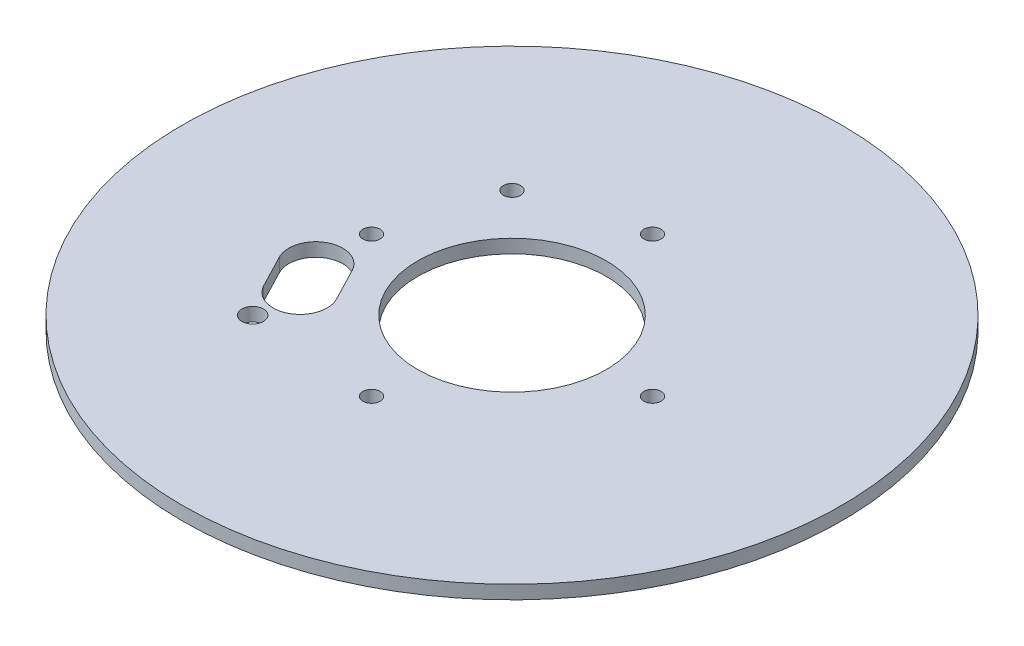
ISO-10303-21;
HEADER;
FILE_DESCRIPTION(('STEP AP214'),'2;1');
FILE_NAME('part.step','',(''),(''),'','','');
FILE_SCHEMA(('AUTOMOTIVE_DESIGN { 1 0 10303 214 1 1 1 1 }'));
ENDSEC;
DATA;
#1=APPLICATION_CONTEXT('core data for automotive mechanical design processes');
#2=APPLICATION_PROTOCOL_DEFINITION('international standard','automotive_design',2000,#1);
#3=PRODUCT_CONTEXT('',#1,'mechanical');
#4=PRODUCT('Part','Part','',(#3));
#5=PRODUCT_RELATED_PRODUCT_CATEGORY('part','',(#4));
#6=PRODUCT_DEFINITION_FORMATION('','',#4);
#7=PRODUCT_DEFINITION_CONTEXT('part definition',#1,'design');
#8=PRODUCT_DEFINITION('design','',#6,#7);
#9=PRODUCT_DEFINITION_SHAPE('','',#8);
#10=(LENGTH_UNIT() NAMED_UNIT(*) SI_UNIT(.MILLI.,.METRE.));
#11=(NAMED_UNIT(*) PLANE_ANGLE_UNIT() SI_UNIT($,.RADIAN.));
#12=(NAMED_UNIT(*) SI_UNIT($,.STERADIAN.) SOLID_ANGLE_UNIT());
#13=UNCERTAINTY_MEASURE_WITH_UNIT(LENGTH_MEASURE(1.E-05),#10,'distance_accuracy_value','');
#14=(GEOMETRIC_REPRESENTATION_CONTEXT(3) GLOBAL_UNCERTAINTY_ASSIGNED_CONTEXT((#13)) GLOBAL_UNIT_ASSIGNED_CONTEXT((#10,
#11,#12)) REPRESENTATION_CONTEXT('',''));
#15=CARTESIAN_POINT('',(0.,0.,0.));
#16=DIRECTION('',(0.,0.,1.));
#17=DIRECTION('',(1.,0.,0.));
#18=AXIS2_PLACEMENT_3D('',#15,#16,#17);
#19=CARTESIAN_POINT('',(0.,3.175,0.));
#20=DIRECTION('',(0.,-1.,0.));
#21=DIRECTION('',(0.,0.,-1.));
#22=AXIS2_PLACEMENT_3D('',#19,#20,#21);
#23=CYLINDRICAL_SURFACE('',#22,77.4600051);
#24=CARTESIAN_POINT('',(0.,3.175,0.));
#25=DIRECTION('',(0.,1.,0.));
#26=DIRECTION('',(0.,0.,1.));
#27=AXIS2_PLACEMENT_3D('',#24,#25,#26);
#28=CIRCLE('',#27,77.4600051);
#29=CARTESIAN_POINT('',(0.,3.175,77.4600051));
#30=VERTEX_POINT('',#29);
#31=EDGE_CURVE('E11',#30,#30,#28,.T.);
#32=ORIENTED_EDGE('',*,*,#31,.F.);
#33=EDGE_LOOP('',(#32));
#34=FACE_BOUND('',#33,.T.);
#35=CARTESIAN_POINT('',(0.,0.,0.));
#36=DIRECTION('',(0.,1.,0.));
#37=DIRECTION('',(0.,0.,1.));
#38=AXIS2_PLACEMENT_3D('',#35,#36,#37);
#39=CIRCLE('',#38,77.4600051);
#40=CARTESIAN_POINT('',(0.,0.,77.4600051));
#41=VERTEX_POINT('',#40);
#42=EDGE_CURVE('E38',#41,#41,#39,.T.);
#43=ORIENTED_EDGE('',*,*,#42,.T.);
#44=EDGE_LOOP('',(#43));
#45=FACE_BOUND('',#44,.T.);
#46=ADVANCED_FACE('F35',(#34,#45),#23,.T.);
#47=CARTESIAN_POINT('',(0.,3.175,0.));
#48=DIRECTION('',(0.,1.,0.));
#49=DIRECTION('',(0.,0.,1.));
#50=AXIS2_PLACEMENT_3D('',#47,#48,#49);
#51=PLANE('',#50);
#52=CARTESIAN_POINT('',(-33.5359357397664,3.175,12.5896679089743));
#53=DIRECTION('',(0.,1.,0.));
#54=DIRECTION('',(0.,0.,1.));
#55=AXIS2_PLACEMENT_3D('',#52,#53,#54);
#56=CIRCLE('',#55,6.35);
#57=CARTESIAN_POINT('',(-27.9034169490847,3.175,9.65756421493181));
#58=VERTEX_POINT('',#57);
#59=CARTESIAN_POINT('',(-39.1684545304481,3.175,15.5217716030168));
#60=VERTEX_POINT('',#59);
#61=EDGE_CURVE('E49',#58,#60,#56,.T.);
#62=ORIENTED_EDGE('',*,*,#61,.F.);
#63=DIRECTION('',(-0.461748613235035,0.,-0.887010833178221));
#64=VECTOR('',#63,1.);
#65=CARTESIAN_POINT('',(-27.9034169490847,3.175,9.65756421493181));
#66=LINE('',#65,#64);
#67=CARTESIAN_POINT('',(-23.9157559251869,3.175,17.3177897702589));
#68=VERTEX_POINT('',#67);
#69=EDGE_CURVE('E93',#68,#58,#66,.T.);
#70=ORIENTED_EDGE('',*,*,#69,.F.);
#71=CARTESIAN_POINT('',(-29.5482747158687,3.175,20.2498934643014));
#72=DIRECTION('',(0.,1.,0.));
#73=DIRECTION('',(0.,0.,1.));
#74=AXIS2_PLACEMENT_3D('',#71,#72,#73);
#75=CIRCLE('',#74,6.35);
#76=CARTESIAN_POINT('',(-35.1807935065504,3.175,23.1819971583439));
#77=VERTEX_POINT('',#76);
#78=EDGE_CURVE('E96',#77,#68,#75,.T.);
#79=ORIENTED_EDGE('',*,*,#78,.F.);
#80=DIRECTION('',(0.461748613235035,0.,0.887010833178221));
#81=VECTOR('',#80,1.);
#82=CARTESIAN_POINT('',(-39.1684545304481,3.175,15.5217716030168));
#83=LINE('',#82,#81);
#84=EDGE_CURVE('E105',#60,#77,#83,.T.);
#85=ORIENTED_EDGE('',*,*,#84,.F.);
#86=EDGE_LOOP('',(#62,#70,#79,#85));
#87=FACE_BOUND('',#86,.T.);
#88=CARTESIAN_POINT('',(-25.4,3.175,-25.4));
#89=DIRECTION('',(0.,1.,0.));
#90=DIRECTION('',(0.,0.,1.));
#91=AXIS2_PLACEMENT_3D('',#88,#89,#90);
#92=CIRCLE('',#91,2.0193);
#93=CARTESIAN_POINT('',(-25.4,3.175,-23.3807));
#94=VERTEX_POINT('',#93);
#95=EDGE_CURVE('E99',#94,#94,#92,.T.);
#96=ORIENTED_EDGE('',*,*,#95,.F.);
#97=EDGE_LOOP('',(#96));
#98=FACE_BOUND('',#97,.T.);
#99=CARTESIAN_POINT('',(-30.48,3.175,30.48));
#100=DIRECTION('',(0.,1.,0.));
#101=DIRECTION('',(0.,0.,1.));
#102=AXIS2_PLACEMENT_3D('',#99,#100,#101);
#103=CIRCLE('',#102,2.54);
#104=CARTESIAN_POINT('',(-30.48,3.175,33.02));
#105=VERTEX_POINT('',#104);
#106=EDGE_CURVE('E208',#105,#105,#103,.T.);
#107=ORIENTED_EDGE('',*,*,#106,.F.);
#108=EDGE_LOOP('',(#107));
#109=FACE_BOUND('',#108,.T.);
#110=CARTESIAN_POINT('',(0.,3.175,33.02));
#111=DIRECTION('',(0.,1.,0.));
#112=DIRECTION('',(0.,0.,1.));
#113=AXIS2_PLACEMENT_3D('',#110,#111,#112);
#114=CIRCLE('',#113,2.0193);
#115=CARTESIAN_POINT('',(0.,3.175,35.0393));
#116=VERTEX_POINT('',#115);
#117=EDGE_CURVE('E202',#116,#116,#114,.T.);
#118=ORIENTED_EDGE('',*,*,#117,.F.);
#119=EDGE_LOOP('',(#118));
#120=FACE_BOUND('',#119,.T.);
#121=CARTESIAN_POINT('',(-33.02,3.175,0.));
#122=DIRECTION('',(0.,1.,0.));
#123=DIRECTION('',(0.,0.,1.));
#124=AXIS2_PLACEMENT_3D('',#121,#122,#123);
#125=CIRCLE('',#124,2.0193);
#126=CARTESIAN_POINT('',(-33.02,3.175,2.0193));
#127=VERTEX_POINT('',#126);
#128=EDGE_CURVE('E130',#127,#127,#125,.T.);
#129=ORIENTED_EDGE('',*,*,#128,.F.);
#130=EDGE_LOOP('',(#129));
#131=FACE_BOUND('',#130,.T.);
#132=CARTESIAN_POINT('',(33.02,3.175,0.));
#133=DIRECTION('',(0.,1.,0.));
#134=DIRECTION('',(0.,0.,1.));
#135=AXIS2_PLACEMENT_3D('',#132,#133,#134);
#136=CIRCLE('',#135,2.0193);
#137=CARTESIAN_POINT('',(33.02,3.175,2.0193));
#138=VERTEX_POINT('',#137);
#139=EDGE_CURVE('E124',#138,#138,#136,.T.);
#140=ORIENTED_EDGE('',*,*,#139,.F.);
#141=EDGE_LOOP('',(#140));
#142=FACE_BOUND('',#141,.T.);
#143=CARTESIAN_POINT('',(0.,3.175,-33.02));
#144=DIRECTION('',(0.,1.,0.));
#145=DIRECTION('',(0.,0.,1.));
#146=AXIS2_PLACEMENT_3D('',#143,#144,#145);
#147=CIRCLE('',#146,2.0193);
#148=CARTESIAN_POINT('',(0.,3.175,-31.0007));
#149=VERTEX_POINT('',#148);
#150=EDGE_CURVE('E118',#149,#149,#147,.T.);
#151=ORIENTED_EDGE('',*,*,#150,.F.);
#152=EDGE_LOOP('',(#151));
#153=FACE_BOUND('',#152,.T.);
#154=CARTESIAN_POINT('',(0.,3.175,0.));
#155=DIRECTION('',(0.,1.,0.));
#156=DIRECTION('',(0.,0.,1.));
#157=AXIS2_PLACEMENT_3D('',#154,#155,#156);
#158=CIRCLE('',#157,22.1615);
#159=CARTESIAN_POINT('',(0.,3.175,22.1615));
#160=VERTEX_POINT('',#159);
#161=EDGE_CURVE('E117',#160,#160,#158,.T.);
#162=ORIENTED_EDGE('',*,*,#161,.F.);
#163=EDGE_LOOP('',(#162));
#164=FACE_BOUND('',#163,.T.);
#165=ORIENTED_EDGE('',*,*,#31,.T.);
#166=EDGE_LOOP('',(#165));
#167=FACE_BOUND('',#166,.T.);
#168=ADVANCED_FACE('F142',(#87,#98,#109,#120,#131,#142,#153,#164,#167),#51,.T.);
#169=CARTESIAN_POINT('',(0.,0.,0.));
#170=DIRECTION('',(0.,1.,0.));
#171=DIRECTION('',(0.,0.,1.));
#172=AXIS2_PLACEMENT_3D('',#169,#170,#171);
#173=PLANE('',#172);
#174=DIRECTION('',(-0.461748613235035,0.,-0.887010833178221));
#175=VECTOR('',#174,1.);
#176=CARTESIAN_POINT('',(-27.9034169490847,0.,9.65756421493181));
#177=LINE('',#176,#175);
#178=CARTESIAN_POINT('',(-23.9157559251869,0.,17.3177897702589));
#179=VERTEX_POINT('',#178);
#180=CARTESIAN_POINT('',(-27.9034169490847,0.,9.65756421493181));
#181=VERTEX_POINT('',#180);
#182=EDGE_CURVE('E83',#179,#181,#177,.T.);
#183=ORIENTED_EDGE('',*,*,#182,.T.);
#184=CARTESIAN_POINT('',(-33.5359357397664,0.,12.5896679089743));
#185=DIRECTION('',(0.,1.,0.));
#186=DIRECTION('',(0.,0.,1.));
#187=AXIS2_PLACEMENT_3D('',#184,#185,#186);
#188=CIRCLE('',#187,6.35);
#189=CARTESIAN_POINT('',(-39.1684545304481,0.,15.5217716030168));
#190=VERTEX_POINT('',#189);
#191=EDGE_CURVE('E77',#181,#190,#188,.T.);
#192=ORIENTED_EDGE('',*,*,#191,.T.);
#193=DIRECTION('',(0.461748613235035,0.,0.887010833178221));
#194=VECTOR('',#193,1.);
#195=CARTESIAN_POINT('',(-39.1684545304481,0.,15.5217716030168));
#196=LINE('',#195,#194);
#197=CARTESIAN_POINT('',(-35.1807935065503,0.,23.1819971583439));
#198=VERTEX_POINT('',#197);
#199=EDGE_CURVE('E86',#190,#198,#196,.T.);
#200=ORIENTED_EDGE('',*,*,#199,.T.);
#201=CARTESIAN_POINT('',(-29.5482747158687,0.,20.2498934643014));
#202=DIRECTION('',(0.,1.,0.));
#203=DIRECTION('',(0.,0.,1.));
#204=AXIS2_PLACEMENT_3D('',#201,#202,#203);
#205=CIRCLE('',#204,6.35);
#206=EDGE_CURVE('E57',#198,#179,#205,.T.);
#207=ORIENTED_EDGE('',*,*,#206,.T.);
#208=EDGE_LOOP('',(#183,#192,#200,#207));
#209=FACE_BOUND('',#208,.T.);
#210=CARTESIAN_POINT('',(-25.4,0.,-25.4));
#211=DIRECTION('',(0.,1.,0.));
#212=DIRECTION('',(0.,0.,1.));
#213=AXIS2_PLACEMENT_3D('',#210,#211,#212);
#214=CIRCLE('',#213,2.0193);
#215=CARTESIAN_POINT('',(-25.4,0.,-23.3807));
#216=VERTEX_POINT('',#215);
#217=EDGE_CURVE('E212',#216,#216,#214,.T.);
#218=ORIENTED_EDGE('',*,*,#217,.T.);
#219=EDGE_LOOP('',(#218));
#220=FACE_BOUND('',#219,.T.);
#221=CARTESIAN_POINT('',(-30.48,0.,30.48));
#222=DIRECTION('',(0.,1.,0.));
#223=DIRECTION('',(0.,0.,1.));
#224=AXIS2_PLACEMENT_3D('',#221,#222,#223);
#225=CIRCLE('',#224,2.54);
#226=CARTESIAN_POINT('',(-30.48,0.,33.02));
#227=VERTEX_POINT('',#226);
#228=EDGE_CURVE('E204',#227,#227,#225,.T.);
#229=ORIENTED_EDGE('',*,*,#228,.T.);
#230=EDGE_LOOP('',(#229));
#231=FACE_BOUND('',#230,.T.);
#232=CARTESIAN_POINT('',(0.,0.,33.02));
#233=DIRECTION('',(0.,1.,0.));
#234=DIRECTION('',(0.,0.,1.));
#235=AXIS2_PLACEMENT_3D('',#232,#233,#234);
#236=CIRCLE('',#235,2.0193);
#237=CARTESIAN_POINT('',(0.,0.,35.0393));
#238=VERTEX_POINT('',#237);
#239=EDGE_CURVE('E133',#238,#238,#236,.T.);
#240=ORIENTED_EDGE('',*,*,#239,.T.);
#241=EDGE_LOOP('',(#240));
#242=FACE_BOUND('',#241,.T.);
#243=CARTESIAN_POINT('',(-33.02,0.,0.));
#244=DIRECTION('',(0.,1.,0.));
#245=DIRECTION('',(0.,0.,1.));
#246=AXIS2_PLACEMENT_3D('',#243,#244,#245);
#247=CIRCLE('',#246,2.0193);
#248=CARTESIAN_POINT('',(-33.02,0.,2.0193));
#249=VERTEX_POINT('',#248);
#250=EDGE_CURVE('E127',#249,#249,#247,.T.);
#251=ORIENTED_EDGE('',*,*,#250,.T.);
#252=EDGE_LOOP('',(#251));
#253=FACE_BOUND('',#252,.T.);
#254=CARTESIAN_POINT('',(33.02,0.,0.));
#255=DIRECTION('',(0.,1.,0.));
#256=DIRECTION('',(0.,0.,1.));
#257=AXIS2_PLACEMENT_3D('',#254,#255,#256);
#258=CIRCLE('',#257,2.0193);
#259=CARTESIAN_POINT('',(33.02,0.,2.0193));
#260=VERTEX_POINT('',#259);
#261=EDGE_CURVE('E121',#260,#260,#258,.T.);
#262=ORIENTED_EDGE('',*,*,#261,.T.);
#263=EDGE_LOOP('',(#262));
#264=FACE_BOUND('',#263,.T.);
#265=CARTESIAN_POINT('',(0.,0.,-33.02));
#266=DIRECTION('',(0.,1.,0.));
#267=DIRECTION('',(0.,0.,1.));
#268=AXIS2_PLACEMENT_3D('',#265,#266,#267);
#269=CIRCLE('',#268,2.0193);
#270=CARTESIAN_POINT('',(0.,0.,-31.0007));
#271=VERTEX_POINT('',#270);
#272=EDGE_CURVE('E114',#271,#271,#269,.T.);
#273=ORIENTED_EDGE('',*,*,#272,.T.);
#274=EDGE_LOOP('',(#273));
#275=FACE_BOUND('',#274,.T.);
#276=CARTESIAN_POINT('',(0.,0.,0.));
#277=DIRECTION('',(0.,1.,0.));
#278=DIRECTION('',(0.,0.,1.));
#279=AXIS2_PLACEMENT_3D('',#276,#277,#278);
#280=CIRCLE('',#279,22.1615);
#281=CARTESIAN_POINT('',(0.,0.,22.1615));
#282=VERTEX_POINT('',#281);
#283=EDGE_CURVE('E134',#282,#282,#280,.T.);
#284=ORIENTED_EDGE('',*,*,#283,.T.);
#285=EDGE_LOOP('',(#284));
#286=FACE_BOUND('',#285,.T.);
#287=ORIENTED_EDGE('',*,*,#42,.F.);
#288=EDGE_LOOP('',(#287));
#289=FACE_BOUND('',#288,.T.);
#290=ADVANCED_FACE('F90',(#209,#220,#231,#242,#253,#264,#275,#286,#289),#173,.F.);
#291=CARTESIAN_POINT('',(0.,0.,0.));
#292=DIRECTION('',(0.,1.,0.));
#293=DIRECTION('',(0.,0.,1.));
#294=AXIS2_PLACEMENT_3D('',#291,#292,#293);
#295=CYLINDRICAL_SURFACE('',#294,22.1615);
#296=ORIENTED_EDGE('',*,*,#283,.F.);
#297=EDGE_LOOP('',(#296));
#298=FACE_BOUND('',#297,.T.);
#299=ORIENTED_EDGE('',*,*,#161,.T.);
#300=EDGE_LOOP('',(#299));
#301=FACE_BOUND('',#300,.T.);
#302=ADVANCED_FACE('F140',(#298,#301),#295,.F.);
#303=CARTESIAN_POINT('',(0.,0.,-33.02));
#304=DIRECTION('',(0.,1.,0.));
#305=DIRECTION('',(0.,0.,1.));
#306=AXIS2_PLACEMENT_3D('',#303,#304,#305);
#307=CYLINDRICAL_SURFACE('',#306,2.0193);
#308=ORIENTED_EDGE('',*,*,#272,.F.);
#309=EDGE_LOOP('',(#308));
#310=FACE_BOUND('',#309,.T.);
#311=ORIENTED_EDGE('',*,*,#150,.T.);
#312=EDGE_LOOP('',(#311));
#313=FACE_BOUND('',#312,.T.);
#314=ADVANCED_FACE('F158',(#310,#313),#307,.F.);
#315=CARTESIAN_POINT('',(33.02,0.,0.));
#316=DIRECTION('',(0.,1.,0.));
#317=DIRECTION('',(0.,0.,1.));
#318=AXIS2_PLACEMENT_3D('',#315,#316,#317);
#319=CYLINDRICAL_SURFACE('',#318,2.0193);
#320=ORIENTED_EDGE('',*,*,#261,.F.);
#321=EDGE_LOOP('',(#320));
#322=FACE_BOUND('',#321,.T.);
#323=ORIENTED_EDGE('',*,*,#139,.T.);
#324=EDGE_LOOP('',(#323));
#325=FACE_BOUND('',#324,.T.);
#326=ADVANCED_FACE('F166',(#322,#325),#319,.F.);
#327=CARTESIAN_POINT('',(-33.02,0.,0.));
#328=DIRECTION('',(0.,1.,0.));
#329=DIRECTION('',(0.,0.,1.));
#330=AXIS2_PLACEMENT_3D('',#327,#328,#329);
#331=CYLINDRICAL_SURFACE('',#330,2.0193);
#332=ORIENTED_EDGE('',*,*,#250,.F.);
#333=EDGE_LOOP('',(#332));
#334=FACE_BOUND('',#333,.T.);
#335=ORIENTED_EDGE('',*,*,#128,.T.);
#336=EDGE_LOOP('',(#335));
#337=FACE_BOUND('',#336,.T.);
#338=ADVANCED_FACE('F162',(#334,#337),#331,.F.);
#339=CARTESIAN_POINT('',(0.,0.,33.02));
#340=DIRECTION('',(0.,1.,0.));
#341=DIRECTION('',(0.,0.,1.));
#342=AXIS2_PLACEMENT_3D('',#339,#340,#341);
#343=CYLINDRICAL_SURFACE('',#342,2.0193);
#344=ORIENTED_EDGE('',*,*,#239,.F.);
#345=EDGE_LOOP('',(#344));
#346=FACE_BOUND('',#345,.T.);
#347=ORIENTED_EDGE('',*,*,#117,.T.);
#348=EDGE_LOOP('',(#347));
#349=FACE_BOUND('',#348,.T.);
#350=ADVANCED_FACE('F165',(#346,#349),#343,.F.);
#351=CARTESIAN_POINT('',(-30.48,0.,30.48));
#352=DIRECTION('',(0.,1.,0.));
#353=DIRECTION('',(0.,0.,1.));
#354=AXIS2_PLACEMENT_3D('',#351,#352,#353);
#355=CYLINDRICAL_SURFACE('',#354,2.54);
#356=ORIENTED_EDGE('',*,*,#228,.F.);
#357=EDGE_LOOP('',(#356));
#358=FACE_BOUND('',#357,.T.);
#359=ORIENTED_EDGE('',*,*,#106,.T.);
#360=EDGE_LOOP('',(#359));
#361=FACE_BOUND('',#360,.T.);
#362=ADVANCED_FACE('F188',(#358,#361),#355,.F.);
#363=CARTESIAN_POINT('',(-25.4,0.,-25.4));
#364=DIRECTION('',(0.,1.,0.));
#365=DIRECTION('',(0.,0.,1.));
#366=AXIS2_PLACEMENT_3D('',#363,#364,#365);
#367=CYLINDRICAL_SURFACE('',#366,2.0193);
#368=ORIENTED_EDGE('',*,*,#217,.F.);
#369=EDGE_LOOP('',(#368));
#370=FACE_BOUND('',#369,.T.);
#371=ORIENTED_EDGE('',*,*,#95,.T.);
#372=EDGE_LOOP('',(#371));
#373=FACE_BOUND('',#372,.T.);
#374=ADVANCED_FACE('F177',(#370,#373),#367,.F.);
#375=CARTESIAN_POINT('',(-33.5359357397664,0.,12.5896679089743));
#376=DIRECTION('',(0.,1.,0.));
#377=DIRECTION('',(0.,0.,1.));
#378=AXIS2_PLACEMENT_3D('',#375,#376,#377);
#379=CYLINDRICAL_SURFACE('',#378,6.35);
#380=ORIENTED_EDGE('',*,*,#61,.T.);
#381=DIRECTION('',(0.,1.,0.));
#382=VECTOR('',#381,1.);
#383=CARTESIAN_POINT('',(-39.1684545304481,0.,15.5217716030168));
#384=LINE('',#383,#382);
#385=EDGE_CURVE('E73',#190,#60,#384,.T.);
#386=ORIENTED_EDGE('',*,*,#385,.F.);
#387=ORIENTED_EDGE('',*,*,#191,.F.);
#388=DIRECTION('',(0.,1.,0.));
#389=VECTOR('',#388,1.);
#390=CARTESIAN_POINT('',(-27.9034169490847,0.,9.65756421493181));
#391=LINE('',#390,#389);
#392=EDGE_CURVE('E109',#181,#58,#391,.T.);
#393=ORIENTED_EDGE('',*,*,#392,.T.);
#394=EDGE_LOOP('',(#380,#386,#387,#393));
#395=FACE_BOUND('',#394,.T.);
#396=ADVANCED_FACE('F75',(#395),#379,.F.);
#397=CARTESIAN_POINT('',(-27.9034169490847,0.,9.65756421493181));
#398=DIRECTION('',(0.887010833178221,0.,-0.461748613235035));
#399=DIRECTION('',(-0.461748613235035,0.,-0.887010833178221));
#400=AXIS2_PLACEMENT_3D('',#397,#398,#399);
#401=PLANE('',#400);
#402=ORIENTED_EDGE('',*,*,#69,.T.);
#403=ORIENTED_EDGE('',*,*,#392,.F.);
#404=ORIENTED_EDGE('',*,*,#182,.F.);
#405=DIRECTION('',(0.,1.,0.));
#406=VECTOR('',#405,1.);
#407=CARTESIAN_POINT('',(-23.9157559251869,0.,17.3177897702589));
#408=LINE('',#407,#406);
#409=EDGE_CURVE('E111',#179,#68,#408,.T.);
#410=ORIENTED_EDGE('',*,*,#409,.T.);
#411=EDGE_LOOP('',(#402,#403,#404,#410));
#412=FACE_BOUND('',#411,.T.);
#413=ADVANCED_FACE('F176',(#412),#401,.F.);
#414=CARTESIAN_POINT('',(-29.5482747158687,0.,20.2498934643014));
#415=DIRECTION('',(0.,1.,0.));
#416=DIRECTION('',(0.,0.,1.));
#417=AXIS2_PLACEMENT_3D('',#414,#415,#416);
#418=CYLINDRICAL_SURFACE('',#417,6.35);
#419=ORIENTED_EDGE('',*,*,#78,.T.);
#420=ORIENTED_EDGE('',*,*,#409,.F.);
#421=ORIENTED_EDGE('',*,*,#206,.F.);
#422=DIRECTION('',(0.,1.,0.));
#423=VECTOR('',#422,1.);
#424=CARTESIAN_POINT('',(-35.1807935065504,0.,23.1819971583439));
#425=LINE('',#424,#423);
#426=EDGE_CURVE('E82',#198,#77,#425,.T.);
#427=ORIENTED_EDGE('',*,*,#426,.T.);
#428=EDGE_LOOP('',(#419,#420,#421,#427));
#429=FACE_BOUND('',#428,.T.);
#430=ADVANCED_FACE('F180',(#429),#418,.F.);
#431=CARTESIAN_POINT('',(-39.1684545304481,0.,15.5217716030168));
#432=DIRECTION('',(-0.887010833178221,0.,0.461748613235035));
#433=DIRECTION('',(0.461748613235035,0.,0.887010833178221));
#434=AXIS2_PLACEMENT_3D('',#431,#432,#433);
#435=PLANE('',#434);
#436=ORIENTED_EDGE('',*,*,#84,.T.);
#437=ORIENTED_EDGE('',*,*,#426,.F.);
#438=ORIENTED_EDGE('',*,*,#199,.F.);
#439=ORIENTED_EDGE('',*,*,#385,.T.);
#440=EDGE_LOOP('',(#436,#437,#438,#439));
#441=FACE_BOUND('',#440,.T.);
#442=ADVANCED_FACE('F87',(#441),#435,.F.);
#443=CLOSED_SHELL('',(#46,#168,#290,#302,#314,#326,#338,#350,#362,#374,#396,#413,#430,#442));
#444=MANIFOLD_SOLID_BREP('B2',#443);
#445=ADVANCED_BREP_SHAPE_REPRESENTATION('',(#18,#444),#14);
#446=SHAPE_DEFINITION_REPRESENTATION(#9,#445);
ENDSEC;
END-ISO-10303-21;
